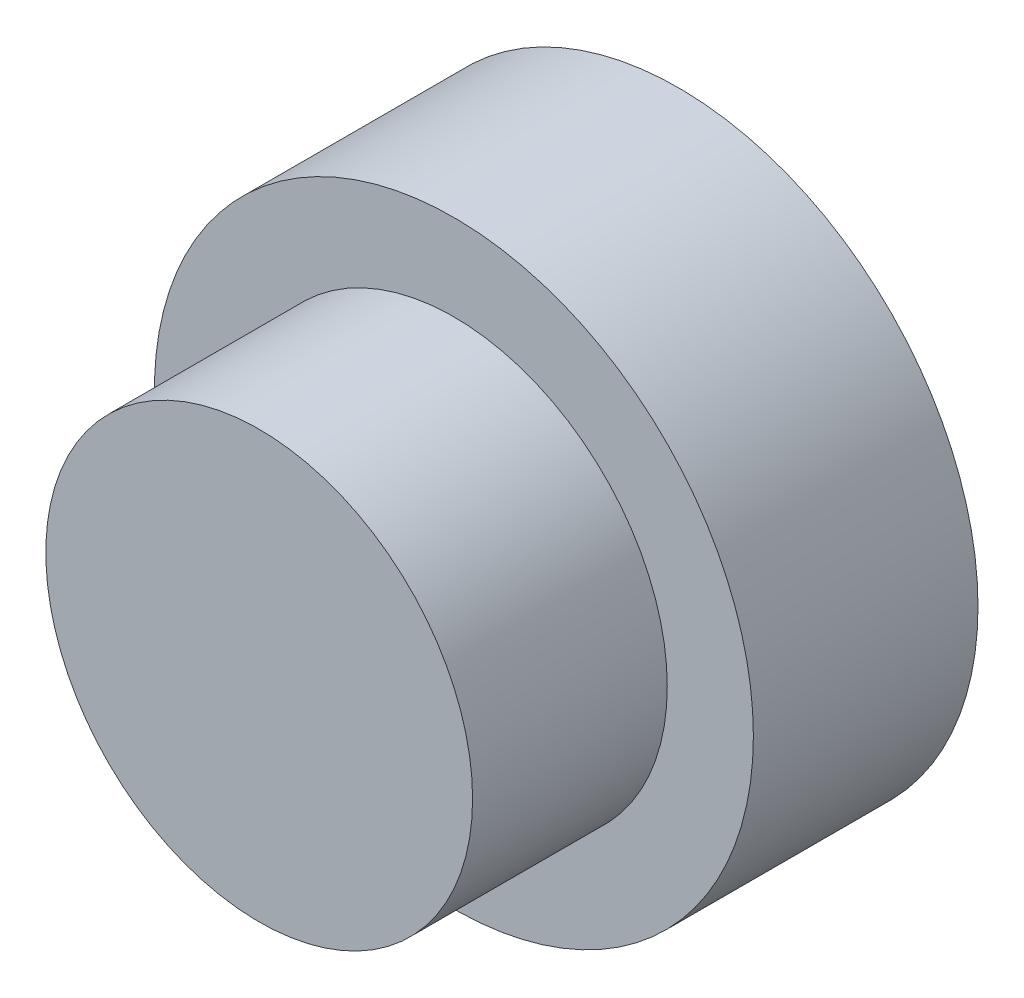
ISO-10303-21;
HEADER;
FILE_DESCRIPTION(('STEP AP214'),'2;1');
FILE_NAME('part.step','',(''),(''),'','','');
FILE_SCHEMA(('AUTOMOTIVE_DESIGN { 1 0 10303 214 1 1 1 1 }'));
ENDSEC;
DATA;
#1=APPLICATION_CONTEXT('core data for automotive mechanical design processes');
#2=APPLICATION_PROTOCOL_DEFINITION('international standard','automotive_design',2000,#1);
#3=PRODUCT_CONTEXT('',#1,'mechanical');
#4=PRODUCT('Part','Part','',(#3));
#5=PRODUCT_RELATED_PRODUCT_CATEGORY('part','',(#4));
#6=PRODUCT_DEFINITION_FORMATION('','',#4);
#7=PRODUCT_DEFINITION_CONTEXT('part definition',#1,'design');
#8=PRODUCT_DEFINITION('design','',#6,#7);
#9=PRODUCT_DEFINITION_SHAPE('','',#8);
#10=(LENGTH_UNIT() NAMED_UNIT(*) SI_UNIT(.MILLI.,.METRE.));
#11=(NAMED_UNIT(*) PLANE_ANGLE_UNIT() SI_UNIT($,.RADIAN.));
#12=(NAMED_UNIT(*) SI_UNIT($,.STERADIAN.) SOLID_ANGLE_UNIT());
#13=UNCERTAINTY_MEASURE_WITH_UNIT(LENGTH_MEASURE(1.E-05),#10,'distance_accuracy_value','');
#14=(GEOMETRIC_REPRESENTATION_CONTEXT(3) GLOBAL_UNCERTAINTY_ASSIGNED_CONTEXT((#13)) GLOBAL_UNIT_ASSIGNED_CONTEXT((#10,
#11,#12)) REPRESENTATION_CONTEXT('',''));
#15=CARTESIAN_POINT('',(0.,0.,0.));
#16=DIRECTION('',(0.,0.,1.));
#17=DIRECTION('',(1.,0.,0.));
#18=AXIS2_PLACEMENT_3D('',#15,#16,#17);
#19=CARTESIAN_POINT('',(1040.45151186273,-43.5322750673208,3.));
#20=DIRECTION('',(0.,0.,1.));
#21=DIRECTION('',(1.,0.,0.));
#22=AXIS2_PLACEMENT_3D('',#19,#20,#21);
#23=PLANE('',#22);
#24=CARTESIAN_POINT('',(1040.45151186273,-43.5322750673208,3.));
#25=DIRECTION('',(0.,0.,1.));
#26=DIRECTION('',(1.,0.,0.));
#27=AXIS2_PLACEMENT_3D('',#24,#25,#26);
#28=CIRCLE('',#27,3.99999999999999);
#29=CARTESIAN_POINT('',(1044.45151186273,-43.5322750673208,3.));
#30=VERTEX_POINT('',#29);
#31=EDGE_CURVE('E10',#30,#30,#28,.T.);
#32=ORIENTED_EDGE('',*,*,#31,.T.);
#33=EDGE_LOOP('',(#32));
#34=FACE_BOUND('',#33,.T.);
#35=CARTESIAN_POINT('',(1040.45151186273,-43.5322750673208,3.));
#36=DIRECTION('',(0.,0.,1.));
#37=DIRECTION('',(1.,0.,0.));
#38=AXIS2_PLACEMENT_3D('',#35,#36,#37);
#39=CIRCLE('',#38,2.84999999999998);
#40=CARTESIAN_POINT('',(1043.30151186273,-43.5322750673208,3.));
#41=VERTEX_POINT('',#40);
#42=EDGE_CURVE('E46',#41,#41,#39,.T.);
#43=ORIENTED_EDGE('',*,*,#42,.F.);
#44=EDGE_LOOP('',(#43));
#45=FACE_BOUND('',#44,.T.);
#46=ADVANCED_FACE('F33',(#34,#45),#23,.T.);
#47=CARTESIAN_POINT('',(1040.45151186273,-43.5322750673208,3.));
#48=DIRECTION('',(0.,0.,-1.));
#49=DIRECTION('',(-1.,0.,0.));
#50=AXIS2_PLACEMENT_3D('',#47,#48,#49);
#51=CYLINDRICAL_SURFACE('',#50,3.99999999999999);
#52=ORIENTED_EDGE('',*,*,#31,.F.);
#53=EDGE_LOOP('',(#52));
#54=FACE_BOUND('',#53,.T.);
#55=CARTESIAN_POINT('',(1040.45151186273,-43.5322750673208,0.));
#56=DIRECTION('',(0.,0.,1.));
#57=DIRECTION('',(1.,0.,0.));
#58=AXIS2_PLACEMENT_3D('',#55,#56,#57);
#59=CIRCLE('',#58,3.99999999999999);
#60=CARTESIAN_POINT('',(1044.45151186273,-43.5322750673208,0.));
#61=VERTEX_POINT('',#60);
#62=EDGE_CURVE('E37',#61,#61,#59,.T.);
#63=ORIENTED_EDGE('',*,*,#62,.T.);
#64=EDGE_LOOP('',(#63));
#65=FACE_BOUND('',#64,.T.);
#66=ADVANCED_FACE('F35',(#54,#65),#51,.T.);
#67=CARTESIAN_POINT('',(1040.45151186273,-43.5322750673208,0.));
#68=DIRECTION('',(0.,0.,1.));
#69=DIRECTION('',(1.,0.,0.));
#70=AXIS2_PLACEMENT_3D('',#67,#68,#69);
#71=PLANE('',#70);
#72=ORIENTED_EDGE('',*,*,#62,.F.);
#73=EDGE_LOOP('',(#72));
#74=FACE_BOUND('',#73,.T.);
#75=ADVANCED_FACE('F57',(#74),#71,.F.);
#76=CARTESIAN_POINT('',(1040.45151186273,-43.5322750673208,5.6));
#77=DIRECTION('',(0.,0.,-1.));
#78=DIRECTION('',(-1.,0.,0.));
#79=AXIS2_PLACEMENT_3D('',#76,#77,#78);
#80=CYLINDRICAL_SURFACE('',#79,2.84999999999998);
#81=CARTESIAN_POINT('',(1040.45151186273,-43.5322750673208,5.6));
#82=DIRECTION('',(0.,0.,1.));
#83=DIRECTION('',(1.,0.,0.));
#84=AXIS2_PLACEMENT_3D('',#81,#82,#83);
#85=CIRCLE('',#84,2.84999999999998);
#86=CARTESIAN_POINT('',(1043.30151186273,-43.5322750673208,5.6));
#87=VERTEX_POINT('',#86);
#88=EDGE_CURVE('E44',#87,#87,#85,.T.);
#89=ORIENTED_EDGE('',*,*,#88,.F.);
#90=EDGE_LOOP('',(#89));
#91=FACE_BOUND('',#90,.T.);
#92=ORIENTED_EDGE('',*,*,#42,.T.);
#93=EDGE_LOOP('',(#92));
#94=FACE_BOUND('',#93,.T.);
#95=ADVANCED_FACE('F54',(#91,#94),#80,.T.);
#96=CARTESIAN_POINT('',(1040.45151186273,-43.5322750673208,5.6));
#97=DIRECTION('',(0.,0.,1.));
#98=DIRECTION('',(1.,0.,0.));
#99=AXIS2_PLACEMENT_3D('',#96,#97,#98);
#100=PLANE('',#99);
#101=ORIENTED_EDGE('',*,*,#88,.T.);
#102=EDGE_LOOP('',(#101));
#103=FACE_BOUND('',#102,.T.);
#104=ADVANCED_FACE('F52',(#103),#100,.T.);
#105=CLOSED_SHELL('',(#46,#66,#75,#95,#104));
#106=MANIFOLD_SOLID_BREP('B2',#105);
#107=ADVANCED_BREP_SHAPE_REPRESENTATION('',(#18,#106),#14);
#108=SHAPE_DEFINITION_REPRESENTATION(#9,#107);
ENDSEC;
END-ISO-10303-21;
